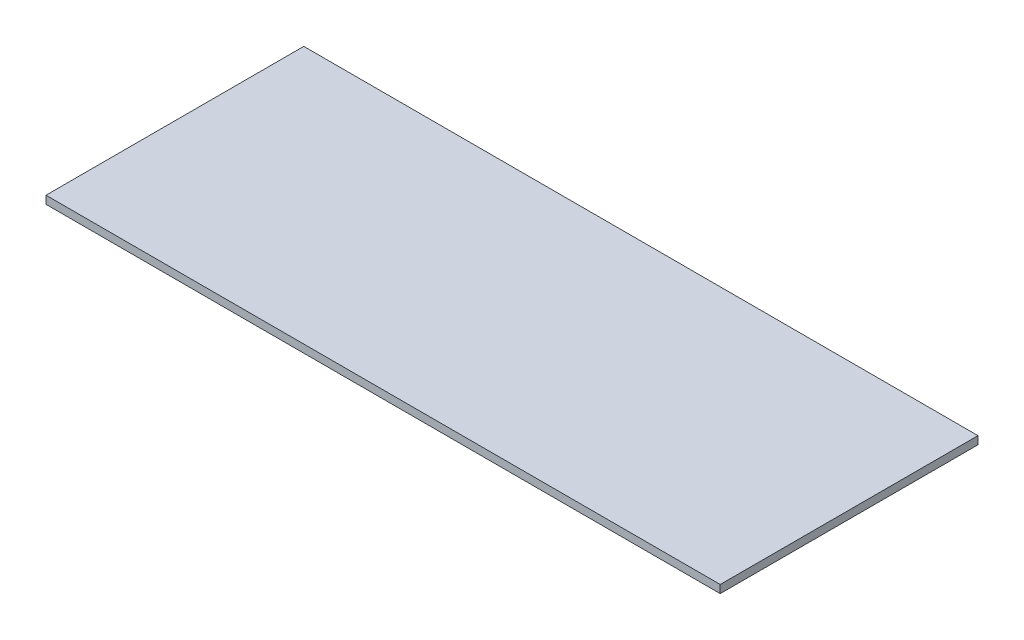
ISO-10303-21;
HEADER;
FILE_DESCRIPTION(('STEP AP214'),'2;1');
FILE_NAME('part.step','',(''),(''),'','','');
FILE_SCHEMA(('AUTOMOTIVE_DESIGN { 1 0 10303 214 1 1 1 1 }'));
ENDSEC;
DATA;
#1=APPLICATION_CONTEXT('core data for automotive mechanical design processes');
#2=APPLICATION_PROTOCOL_DEFINITION('international standard','automotive_design',2000,#1);
#3=PRODUCT_CONTEXT('',#1,'mechanical');
#4=PRODUCT('Part','Part','',(#3));
#5=PRODUCT_RELATED_PRODUCT_CATEGORY('part','',(#4));
#6=PRODUCT_DEFINITION_FORMATION('','',#4);
#7=PRODUCT_DEFINITION_CONTEXT('part definition',#1,'design');
#8=PRODUCT_DEFINITION('design','',#6,#7);
#9=PRODUCT_DEFINITION_SHAPE('','',#8);
#10=(LENGTH_UNIT() NAMED_UNIT(*) SI_UNIT(.MILLI.,.METRE.));
#11=(NAMED_UNIT(*) PLANE_ANGLE_UNIT() SI_UNIT($,.RADIAN.));
#12=(NAMED_UNIT(*) SI_UNIT($,.STERADIAN.) SOLID_ANGLE_UNIT());
#13=UNCERTAINTY_MEASURE_WITH_UNIT(LENGTH_MEASURE(1.E-05),#10,'distance_accuracy_value','');
#14=(GEOMETRIC_REPRESENTATION_CONTEXT(3) GLOBAL_UNCERTAINTY_ASSIGNED_CONTEXT((#13)) GLOBAL_UNIT_ASSIGNED_CONTEXT((#10,
#11,#12)) REPRESENTATION_CONTEXT('',''));
#15=CARTESIAN_POINT('',(0.,0.,0.));
#16=DIRECTION('',(0.,0.,1.));
#17=DIRECTION('',(1.,0.,0.));
#18=AXIS2_PLACEMENT_3D('',#15,#16,#17);
#19=CARTESIAN_POINT('',(130.,75.8,410.));
#20=DIRECTION('',(1.,0.,0.));
#21=DIRECTION('',(0.,0.,-1.));
#22=AXIS2_PLACEMENT_3D('',#19,#20,#21);
#23=PLANE('',#22);
#24=DIRECTION('',(0.,0.,1.));
#25=VECTOR('',#24,1.);
#26=CARTESIAN_POINT('',(130.,71.8,410.));
#27=LINE('',#26,#25);
#28=CARTESIAN_POINT('',(130.,71.8,280.));
#29=VERTEX_POINT('',#28);
#30=CARTESIAN_POINT('',(130.,71.8,410.));
#31=VERTEX_POINT('',#30);
#32=EDGE_CURVE('E102',#29,#31,#27,.T.);
#33=ORIENTED_EDGE('',*,*,#32,.T.);
#34=DIRECTION('',(0.,-1.,0.));
#35=VECTOR('',#34,1.);
#36=CARTESIAN_POINT('',(130.,75.8,410.));
#37=LINE('',#36,#35);
#38=CARTESIAN_POINT('',(130.,75.8,410.));
#39=VERTEX_POINT('',#38);
#40=EDGE_CURVE('E11',#39,#31,#37,.T.);
#41=ORIENTED_EDGE('',*,*,#40,.F.);
#42=DIRECTION('',(0.,0.,1.));
#43=VECTOR('',#42,1.);
#44=CARTESIAN_POINT('',(130.,75.8,410.));
#45=LINE('',#44,#43);
#46=CARTESIAN_POINT('',(130.,75.8,280.));
#47=VERTEX_POINT('',#46);
#48=EDGE_CURVE('E90',#47,#39,#45,.T.);
#49=ORIENTED_EDGE('',*,*,#48,.F.);
#50=DIRECTION('',(0.,-1.,0.));
#51=VECTOR('',#50,1.);
#52=CARTESIAN_POINT('',(130.,75.8,280.));
#53=LINE('',#52,#51);
#54=EDGE_CURVE('E98',#47,#29,#53,.T.);
#55=ORIENTED_EDGE('',*,*,#54,.T.);
#56=EDGE_LOOP('',(#33,#41,#49,#55));
#57=FACE_BOUND('',#56,.T.);
#58=ADVANCED_FACE('F39',(#57),#23,.F.);
#59=CARTESIAN_POINT('',(470.,75.8,410.));
#60=DIRECTION('',(0.,0.,-1.));
#61=DIRECTION('',(-1.,0.,0.));
#62=AXIS2_PLACEMENT_3D('',#59,#60,#61);
#63=PLANE('',#62);
#64=DIRECTION('',(1.,0.,0.));
#65=VECTOR('',#64,1.);
#66=CARTESIAN_POINT('',(470.,71.8,410.));
#67=LINE('',#66,#65);
#68=CARTESIAN_POINT('',(470.,71.8,410.));
#69=VERTEX_POINT('',#68);
#70=EDGE_CURVE('E94',#31,#69,#67,.T.);
#71=ORIENTED_EDGE('',*,*,#70,.T.);
#72=DIRECTION('',(0.,-1.,0.));
#73=VECTOR('',#72,1.);
#74=CARTESIAN_POINT('',(470.,75.8,410.));
#75=LINE('',#74,#73);
#76=CARTESIAN_POINT('',(470.,75.8,410.));
#77=VERTEX_POINT('',#76);
#78=EDGE_CURVE('E47',#77,#69,#75,.T.);
#79=ORIENTED_EDGE('',*,*,#78,.F.);
#80=DIRECTION('',(1.,0.,0.));
#81=VECTOR('',#80,1.);
#82=CARTESIAN_POINT('',(470.,75.8,410.));
#83=LINE('',#82,#81);
#84=EDGE_CURVE('E85',#39,#77,#83,.T.);
#85=ORIENTED_EDGE('',*,*,#84,.F.);
#86=ORIENTED_EDGE('',*,*,#40,.T.);
#87=EDGE_LOOP('',(#71,#79,#85,#86));
#88=FACE_BOUND('',#87,.T.);
#89=ADVANCED_FACE('F93',(#88),#63,.F.);
#90=CARTESIAN_POINT('',(470.,75.8,280.));
#91=DIRECTION('',(-1.,0.,0.));
#92=DIRECTION('',(0.,0.,1.));
#93=AXIS2_PLACEMENT_3D('',#90,#91,#92);
#94=PLANE('',#93);
#95=DIRECTION('',(0.,0.,-1.));
#96=VECTOR('',#95,1.);
#97=CARTESIAN_POINT('',(470.,71.8,280.));
#98=LINE('',#97,#96);
#99=CARTESIAN_POINT('',(470.,71.8,280.));
#100=VERTEX_POINT('',#99);
#101=EDGE_CURVE('E72',#69,#100,#98,.T.);
#102=ORIENTED_EDGE('',*,*,#101,.T.);
#103=DIRECTION('',(0.,-1.,0.));
#104=VECTOR('',#103,1.);
#105=CARTESIAN_POINT('',(470.,75.8,280.));
#106=LINE('',#105,#104);
#107=CARTESIAN_POINT('',(470.,75.8,280.));
#108=VERTEX_POINT('',#107);
#109=EDGE_CURVE('E95',#108,#100,#106,.T.);
#110=ORIENTED_EDGE('',*,*,#109,.F.);
#111=DIRECTION('',(0.,0.,-1.));
#112=VECTOR('',#111,1.);
#113=CARTESIAN_POINT('',(470.,75.8,280.));
#114=LINE('',#113,#112);
#115=EDGE_CURVE('E88',#77,#108,#114,.T.);
#116=ORIENTED_EDGE('',*,*,#115,.F.);
#117=ORIENTED_EDGE('',*,*,#78,.T.);
#118=EDGE_LOOP('',(#102,#110,#116,#117));
#119=FACE_BOUND('',#118,.T.);
#120=ADVANCED_FACE('F96',(#119),#94,.F.);
#121=CARTESIAN_POINT('',(130.,75.8,280.));
#122=DIRECTION('',(0.,0.,1.));
#123=DIRECTION('',(1.,0.,0.));
#124=AXIS2_PLACEMENT_3D('',#121,#122,#123);
#125=PLANE('',#124);
#126=DIRECTION('',(-1.,0.,0.));
#127=VECTOR('',#126,1.);
#128=CARTESIAN_POINT('',(130.,71.8,280.));
#129=LINE('',#128,#127);
#130=EDGE_CURVE('E78',#100,#29,#129,.T.);
#131=ORIENTED_EDGE('',*,*,#130,.T.);
#132=ORIENTED_EDGE('',*,*,#54,.F.);
#133=DIRECTION('',(-1.,0.,0.));
#134=VECTOR('',#133,1.);
#135=CARTESIAN_POINT('',(130.,75.8,280.));
#136=LINE('',#135,#134);
#137=EDGE_CURVE('E55',#108,#47,#136,.T.);
#138=ORIENTED_EDGE('',*,*,#137,.F.);
#139=ORIENTED_EDGE('',*,*,#109,.T.);
#140=EDGE_LOOP('',(#131,#132,#138,#139));
#141=FACE_BOUND('',#140,.T.);
#142=ADVANCED_FACE('F109',(#141),#125,.F.);
#143=CARTESIAN_POINT('',(0.,75.8,0.));
#144=DIRECTION('',(0.,-1.,0.));
#145=DIRECTION('',(0.,0.,-1.));
#146=AXIS2_PLACEMENT_3D('',#143,#144,#145);
#147=PLANE('',#146);
#148=ORIENTED_EDGE('',*,*,#48,.T.);
#149=ORIENTED_EDGE('',*,*,#84,.T.);
#150=ORIENTED_EDGE('',*,*,#115,.T.);
#151=ORIENTED_EDGE('',*,*,#137,.T.);
#152=EDGE_LOOP('',(#148,#149,#150,#151));
#153=FACE_BOUND('',#152,.T.);
#154=ADVANCED_FACE('F86',(#153),#147,.F.);
#155=CARTESIAN_POINT('',(0.,71.8,0.));
#156=DIRECTION('',(0.,-1.,0.));
#157=DIRECTION('',(0.,0.,-1.));
#158=AXIS2_PLACEMENT_3D('',#155,#156,#157);
#159=PLANE('',#158);
#160=ORIENTED_EDGE('',*,*,#32,.F.);
#161=ORIENTED_EDGE('',*,*,#130,.F.);
#162=ORIENTED_EDGE('',*,*,#101,.F.);
#163=ORIENTED_EDGE('',*,*,#70,.F.);
#164=EDGE_LOOP('',(#160,#161,#162,#163));
#165=FACE_BOUND('',#164,.T.);
#166=ADVANCED_FACE('F112',(#165),#159,.T.);
#167=CLOSED_SHELL('',(#58,#89,#120,#142,#154,#166));
#168=MANIFOLD_SOLID_BREP('B2',#167);
#169=ADVANCED_BREP_SHAPE_REPRESENTATION('',(#18,#168),#14);
#170=SHAPE_DEFINITION_REPRESENTATION(#9,#169);
ENDSEC;
END-ISO-10303-21;
